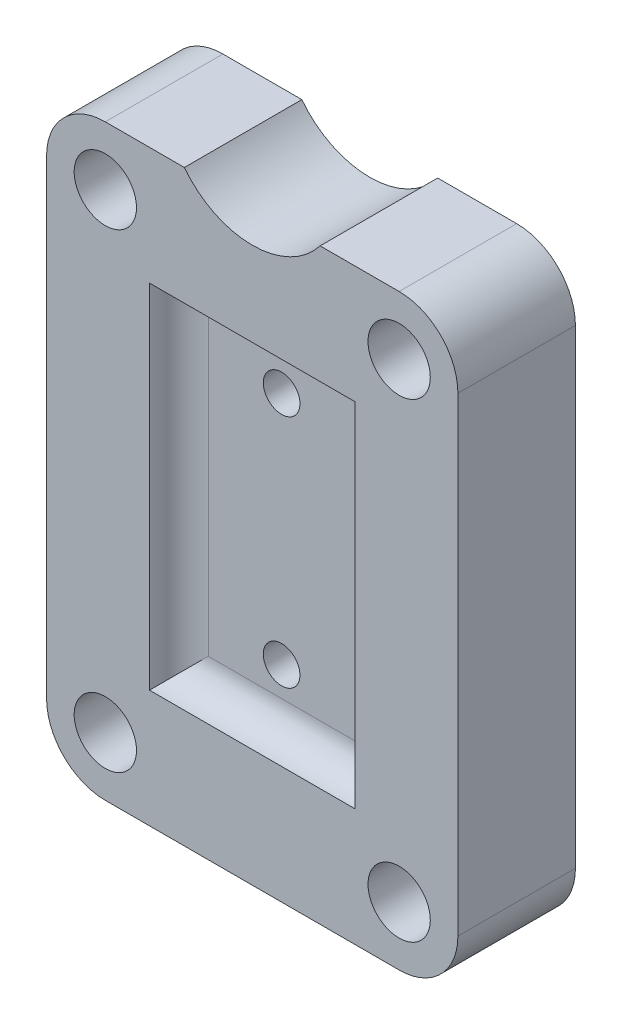
ISO-10303-21;
HEADER;
FILE_DESCRIPTION(('STEP AP214'),'2;1');
FILE_NAME('part.step','',(''),(''),'','','');
FILE_SCHEMA(('AUTOMOTIVE_DESIGN { 1 0 10303 214 1 1 1 1 }'));
ENDSEC;
DATA;
#1=APPLICATION_CONTEXT('core data for automotive mechanical design processes');
#2=APPLICATION_PROTOCOL_DEFINITION('international standard','automotive_design',2000,#1);
#3=PRODUCT_CONTEXT('',#1,'mechanical');
#4=PRODUCT('Part','Part','',(#3));
#5=PRODUCT_RELATED_PRODUCT_CATEGORY('part','',(#4));
#6=PRODUCT_DEFINITION_FORMATION('','',#4);
#7=PRODUCT_DEFINITION_CONTEXT('part definition',#1,'design');
#8=PRODUCT_DEFINITION('design','',#6,#7);
#9=PRODUCT_DEFINITION_SHAPE('','',#8);
#10=(LENGTH_UNIT() NAMED_UNIT(*) SI_UNIT(.MILLI.,.METRE.));
#11=(NAMED_UNIT(*) PLANE_ANGLE_UNIT() SI_UNIT($,.RADIAN.));
#12=(NAMED_UNIT(*) SI_UNIT($,.STERADIAN.) SOLID_ANGLE_UNIT());
#13=UNCERTAINTY_MEASURE_WITH_UNIT(LENGTH_MEASURE(1.E-05),#10,'distance_accuracy_value','');
#14=(GEOMETRIC_REPRESENTATION_CONTEXT(3) GLOBAL_UNCERTAINTY_ASSIGNED_CONTEXT((#13)) GLOBAL_UNIT_ASSIGNED_CONTEXT((#10,
#11,#12)) REPRESENTATION_CONTEXT('',''));
#15=CARTESIAN_POINT('',(0.,0.,0.));
#16=DIRECTION('',(0.,0.,1.));
#17=DIRECTION('',(1.,0.,0.));
#18=AXIS2_PLACEMENT_3D('',#15,#16,#17);
#19=CARTESIAN_POINT('',(44.46,-0.00999999999999889,0.));
#20=DIRECTION('',(0.,0.,-1.));
#21=DIRECTION('',(-1.,0.,0.));
#22=AXIS2_PLACEMENT_3D('',#19,#20,#21);
#23=PLANE('',#22);
#24=CARTESIAN_POINT('',(38.1,6.35,0.));
#25=DIRECTION('',(0.,0.,1.));
#26=DIRECTION('',(1.,0.,0.));
#27=AXIS2_PLACEMENT_3D('',#24,#25,#26);
#28=CIRCLE('',#27,3.3655);
#29=CARTESIAN_POINT('',(41.4655,6.35,0.));
#30=VERTEX_POINT('',#29);
#31=EDGE_CURVE('E139',#30,#30,#28,.F.);
#32=ORIENTED_EDGE('',*,*,#31,.F.);
#33=EDGE_LOOP('',(#32));
#34=FACE_BOUND('',#33,.T.);
#35=CARTESIAN_POINT('',(38.1,57.15,0.));
#36=DIRECTION('',(0.,0.,1.));
#37=DIRECTION('',(1.,0.,0.));
#38=AXIS2_PLACEMENT_3D('',#35,#36,#37);
#39=CIRCLE('',#38,3.3655);
#40=CARTESIAN_POINT('',(41.4655,57.15,0.));
#41=VERTEX_POINT('',#40);
#42=EDGE_CURVE('E142',#41,#41,#39,.F.);
#43=ORIENTED_EDGE('',*,*,#42,.F.);
#44=EDGE_LOOP('',(#43));
#45=FACE_BOUND('',#44,.T.);
#46=CARTESIAN_POINT('',(6.34999999999998,57.15,0.));
#47=DIRECTION('',(0.,0.,1.));
#48=DIRECTION('',(1.,0.,0.));
#49=AXIS2_PLACEMENT_3D('',#46,#47,#48);
#50=CIRCLE('',#49,3.3655);
#51=CARTESIAN_POINT('',(9.71549999999998,57.15,0.));
#52=VERTEX_POINT('',#51);
#53=EDGE_CURVE('E221',#52,#52,#50,.F.);
#54=ORIENTED_EDGE('',*,*,#53,.F.);
#55=EDGE_LOOP('',(#54));
#56=FACE_BOUND('',#55,.T.);
#57=CARTESIAN_POINT('',(6.35,6.35,0.));
#58=DIRECTION('',(0.,0.,1.));
#59=DIRECTION('',(1.,0.,0.));
#60=AXIS2_PLACEMENT_3D('',#57,#58,#59);
#61=CIRCLE('',#60,3.3655);
#62=CARTESIAN_POINT('',(9.7155,6.35,0.));
#63=VERTEX_POINT('',#62);
#64=EDGE_CURVE('E218',#63,#63,#61,.F.);
#65=ORIENTED_EDGE('',*,*,#64,.F.);
#66=EDGE_LOOP('',(#65));
#67=FACE_BOUND('',#66,.T.);
#68=CARTESIAN_POINT('',(22.225,44.45,0.));
#69=DIRECTION('',(0.,0.,1.));
#70=DIRECTION('',(1.,0.,0.));
#71=AXIS2_PLACEMENT_3D('',#68,#69,#70);
#72=CIRCLE('',#71,1.9812);
#73=CARTESIAN_POINT('',(24.2062,44.45,0.));
#74=VERTEX_POINT('',#73);
#75=EDGE_CURVE('E215',#74,#74,#72,.F.);
#76=ORIENTED_EDGE('',*,*,#75,.F.);
#77=EDGE_LOOP('',(#76));
#78=FACE_BOUND('',#77,.T.);
#79=CARTESIAN_POINT('',(22.225,19.05,0.));
#80=DIRECTION('',(0.,0.,-1.));
#81=DIRECTION('',(-1.,0.,0.));
#82=AXIS2_PLACEMENT_3D('',#79,#80,#81);
#83=CIRCLE('',#82,1.9812);
#84=CARTESIAN_POINT('',(20.2438,19.05,0.));
#85=VERTEX_POINT('',#84);
#86=EDGE_CURVE('E212',#85,#85,#83,.T.);
#87=ORIENTED_EDGE('',*,*,#86,.F.);
#88=EDGE_LOOP('',(#87));
#89=FACE_BOUND('',#88,.T.);
#90=CARTESIAN_POINT('',(6.34999999999998,57.15,0.));
#91=DIRECTION('',(0.,0.,-1.));
#92=DIRECTION('',(-1.,0.,0.));
#93=AXIS2_PLACEMENT_3D('',#90,#91,#92);
#94=CIRCLE('',#93,6.35);
#95=CARTESIAN_POINT('',(6.34999999999998,63.5,0.));
#96=VERTEX_POINT('',#95);
#97=CARTESIAN_POINT('',(0.,57.15,0.));
#98=VERTEX_POINT('',#97);
#99=EDGE_CURVE('E230',#96,#98,#94,.F.);
#100=ORIENTED_EDGE('',*,*,#99,.F.);
#101=DIRECTION('',(-1.,0.,0.));
#102=VECTOR('',#101,1.);
#103=CARTESIAN_POINT('',(10.6184298872411,63.5,0.));
#104=LINE('',#103,#102);
#105=CARTESIAN_POINT('',(14.8868597744822,63.5,0.));
#106=VERTEX_POINT('',#105);
#107=EDGE_CURVE('E123',#106,#96,#104,.T.);
#108=ORIENTED_EDGE('',*,*,#107,.F.);
#109=CARTESIAN_POINT('',(22.225,69.1701520438038,0.));
#110=DIRECTION('',(0.,0.,1.));
#111=DIRECTION('',(1.,0.,0.));
#112=AXIS2_PLACEMENT_3D('',#109,#110,#111);
#113=CIRCLE('',#112,9.27356059823923);
#114=CARTESIAN_POINT('',(29.5631402255178,63.5,0.));
#115=VERTEX_POINT('',#114);
#116=EDGE_CURVE('E21',#115,#106,#113,.F.);
#117=ORIENTED_EDGE('',*,*,#116,.F.);
#118=DIRECTION('',(-1.,0.,0.));
#119=VECTOR('',#118,1.);
#120=CARTESIAN_POINT('',(33.8315701127589,63.5,0.));
#121=LINE('',#120,#119);
#122=CARTESIAN_POINT('',(38.1,63.5,0.));
#123=VERTEX_POINT('',#122);
#124=EDGE_CURVE('E121',#123,#115,#121,.T.);
#125=ORIENTED_EDGE('',*,*,#124,.F.);
#126=CARTESIAN_POINT('',(38.1,57.15,0.));
#127=DIRECTION('',(0.,0.,-1.));
#128=DIRECTION('',(-1.,0.,0.));
#129=AXIS2_PLACEMENT_3D('',#126,#127,#128);
#130=CIRCLE('',#129,6.35);
#131=CARTESIAN_POINT('',(44.45,57.15,0.));
#132=VERTEX_POINT('',#131);
#133=EDGE_CURVE('E136',#132,#123,#130,.F.);
#134=ORIENTED_EDGE('',*,*,#133,.F.);
#135=DIRECTION('',(0.,1.,0.));
#136=VECTOR('',#135,1.);
#137=CARTESIAN_POINT('',(44.45,31.75,0.));
#138=LINE('',#137,#136);
#139=CARTESIAN_POINT('',(44.45,6.35,0.));
#140=VERTEX_POINT('',#139);
#141=EDGE_CURVE('E148',#140,#132,#138,.T.);
#142=ORIENTED_EDGE('',*,*,#141,.F.);
#143=CARTESIAN_POINT('',(38.1,6.34999999999999,0.));
#144=DIRECTION('',(0.,0.,-1.));
#145=DIRECTION('',(-1.,0.,0.));
#146=AXIS2_PLACEMENT_3D('',#143,#144,#145);
#147=CIRCLE('',#146,6.35);
#148=CARTESIAN_POINT('',(38.1,0.,0.));
#149=VERTEX_POINT('',#148);
#150=EDGE_CURVE('E227',#149,#140,#147,.F.);
#151=ORIENTED_EDGE('',*,*,#150,.F.);
#152=DIRECTION('',(1.,0.,0.));
#153=VECTOR('',#152,1.);
#154=CARTESIAN_POINT('',(22.225,0.,0.));
#155=LINE('',#154,#153);
#156=CARTESIAN_POINT('',(6.35,0.,0.));
#157=VERTEX_POINT('',#156);
#158=EDGE_CURVE('E152',#157,#149,#155,.T.);
#159=ORIENTED_EDGE('',*,*,#158,.F.);
#160=CARTESIAN_POINT('',(6.35,6.35,0.));
#161=DIRECTION('',(0.,0.,-1.));
#162=DIRECTION('',(-1.,0.,0.));
#163=AXIS2_PLACEMENT_3D('',#160,#161,#162);
#164=CIRCLE('',#163,6.35);
#165=CARTESIAN_POINT('',(0.,6.35,0.));
#166=VERTEX_POINT('',#165);
#167=EDGE_CURVE('E229',#166,#157,#164,.F.);
#168=ORIENTED_EDGE('',*,*,#167,.F.);
#169=DIRECTION('',(0.,-1.,0.));
#170=VECTOR('',#169,1.);
#171=CARTESIAN_POINT('',(0.,31.75,0.));
#172=LINE('',#171,#170);
#173=EDGE_CURVE('E156',#98,#166,#172,.T.);
#174=ORIENTED_EDGE('',*,*,#173,.F.);
#175=EDGE_LOOP('',(#100,#108,#117,#125,#134,#142,#151,#159,#168,#174));
#176=FACE_BOUND('',#175,.T.);
#177=ADVANCED_FACE('F17',(#34,#45,#56,#67,#78,#89,#176),#23,.T.);
#178=CARTESIAN_POINT('',(22.225,69.1701520438038,0.));
#179=DIRECTION('',(0.,0.,1.));
#180=DIRECTION('',(1.,0.,0.));
#181=AXIS2_PLACEMENT_3D('',#178,#179,#180);
#182=CYLINDRICAL_SURFACE('',#181,9.27356059823923);
#183=DIRECTION('',(0.,0.,-1.));
#184=VECTOR('',#183,1.);
#185=CARTESIAN_POINT('',(14.8868597744822,63.5,6.35));
#186=LINE('',#185,#184);
#187=CARTESIAN_POINT('',(14.8868597744822,63.5,12.7));
#188=VERTEX_POINT('',#187);
#189=EDGE_CURVE('E126',#188,#106,#186,.T.);
#190=ORIENTED_EDGE('',*,*,#189,.F.);
#191=CARTESIAN_POINT('',(22.225,69.1701520438038,12.7));
#192=DIRECTION('',(0.,0.,1.));
#193=DIRECTION('',(1.,0.,0.));
#194=AXIS2_PLACEMENT_3D('',#191,#192,#193);
#195=CIRCLE('',#194,9.27356059823923);
#196=CARTESIAN_POINT('',(29.5631402255177,63.5,12.7));
#197=VERTEX_POINT('',#196);
#198=EDGE_CURVE('E131',#197,#188,#195,.F.);
#199=ORIENTED_EDGE('',*,*,#198,.F.);
#200=DIRECTION('',(0.,0.,1.));
#201=VECTOR('',#200,1.);
#202=CARTESIAN_POINT('',(29.5631402255177,63.5,6.35));
#203=LINE('',#202,#201);
#204=EDGE_CURVE('E128',#115,#197,#203,.T.);
#205=ORIENTED_EDGE('',*,*,#204,.F.);
#206=ORIENTED_EDGE('',*,*,#116,.T.);
#207=EDGE_LOOP('',(#190,#199,#205,#206));
#208=FACE_BOUND('',#207,.T.);
#209=ADVANCED_FACE('F129',(#208),#182,.F.);
#210=CARTESIAN_POINT('',(6.33999999999999,63.5,-0.01));
#211=DIRECTION('',(0.,1.,0.));
#212=DIRECTION('',(0.,0.,1.));
#213=AXIS2_PLACEMENT_3D('',#210,#211,#212);
#214=PLANE('',#213);
#215=DIRECTION('',(0.,0.,-1.));
#216=VECTOR('',#215,1.);
#217=CARTESIAN_POINT('',(6.34999999999998,63.5,6.35));
#218=LINE('',#217,#216);
#219=CARTESIAN_POINT('',(6.34999999999998,63.5,12.7));
#220=VERTEX_POINT('',#219);
#221=EDGE_CURVE('E160',#220,#96,#218,.T.);
#222=ORIENTED_EDGE('',*,*,#221,.F.);
#223=DIRECTION('',(-1.,0.,0.));
#224=VECTOR('',#223,1.);
#225=CARTESIAN_POINT('',(22.225,63.5,12.7));
#226=LINE('',#225,#224);
#227=EDGE_CURVE('E210',#188,#220,#226,.T.);
#228=ORIENTED_EDGE('',*,*,#227,.F.);
#229=ORIENTED_EDGE('',*,*,#189,.T.);
#230=ORIENTED_EDGE('',*,*,#107,.T.);
#231=EDGE_LOOP('',(#222,#228,#229,#230));
#232=FACE_BOUND('',#231,.T.);
#233=ADVANCED_FACE('F320',(#232),#214,.T.);
#234=CARTESIAN_POINT('',(6.34999999999998,57.15,12.7));
#235=DIRECTION('',(0.,0.,-1.));
#236=DIRECTION('',(-1.,0.,0.));
#237=AXIS2_PLACEMENT_3D('',#234,#235,#236);
#238=CYLINDRICAL_SURFACE('',#237,6.35);
#239=ORIENTED_EDGE('',*,*,#99,.T.);
#240=DIRECTION('',(0.,0.,-1.));
#241=VECTOR('',#240,1.);
#242=CARTESIAN_POINT('',(0.,57.15,6.35));
#243=LINE('',#242,#241);
#244=CARTESIAN_POINT('',(0.,57.15,12.7));
#245=VERTEX_POINT('',#244);
#246=EDGE_CURVE('E159',#245,#98,#243,.T.);
#247=ORIENTED_EDGE('',*,*,#246,.F.);
#248=CARTESIAN_POINT('',(6.34999999999998,57.15,12.7));
#249=DIRECTION('',(0.,0.,-1.));
#250=DIRECTION('',(-1.,0.,0.));
#251=AXIS2_PLACEMENT_3D('',#248,#249,#250);
#252=CIRCLE('',#251,6.35);
#253=EDGE_CURVE('E207',#220,#245,#252,.F.);
#254=ORIENTED_EDGE('',*,*,#253,.F.);
#255=ORIENTED_EDGE('',*,*,#221,.T.);
#256=EDGE_LOOP('',(#239,#247,#254,#255));
#257=FACE_BOUND('',#256,.T.);
#258=ADVANCED_FACE('F317',(#257),#238,.T.);
#259=CARTESIAN_POINT('',(0.,6.33999999999999,-0.01));
#260=DIRECTION('',(-1.,0.,0.));
#261=DIRECTION('',(0.,0.,1.));
#262=AXIS2_PLACEMENT_3D('',#259,#260,#261);
#263=PLANE('',#262);
#264=DIRECTION('',(0.,0.,-1.));
#265=VECTOR('',#264,1.);
#266=CARTESIAN_POINT('',(0.,6.35,6.35));
#267=LINE('',#266,#265);
#268=CARTESIAN_POINT('',(0.,6.35,12.7));
#269=VERTEX_POINT('',#268);
#270=EDGE_CURVE('E158',#269,#166,#267,.T.);
#271=ORIENTED_EDGE('',*,*,#270,.F.);
#272=DIRECTION('',(0.,-1.,0.));
#273=VECTOR('',#272,1.);
#274=CARTESIAN_POINT('',(0.,31.75,12.7));
#275=LINE('',#274,#273);
#276=EDGE_CURVE('E206',#245,#269,#275,.T.);
#277=ORIENTED_EDGE('',*,*,#276,.F.);
#278=ORIENTED_EDGE('',*,*,#246,.T.);
#279=ORIENTED_EDGE('',*,*,#173,.T.);
#280=EDGE_LOOP('',(#271,#277,#278,#279));
#281=FACE_BOUND('',#280,.T.);
#282=ADVANCED_FACE('F316',(#281),#263,.T.);
#283=CARTESIAN_POINT('',(6.35,6.35,12.7));
#284=DIRECTION('',(0.,0.,-1.));
#285=DIRECTION('',(-1.,0.,0.));
#286=AXIS2_PLACEMENT_3D('',#283,#284,#285);
#287=CYLINDRICAL_SURFACE('',#286,6.35);
#288=ORIENTED_EDGE('',*,*,#167,.T.);
#289=DIRECTION('',(0.,0.,-1.));
#290=VECTOR('',#289,1.);
#291=CARTESIAN_POINT('',(6.35,0.,6.35));
#292=LINE('',#291,#290);
#293=CARTESIAN_POINT('',(6.35,0.,12.7));
#294=VERTEX_POINT('',#293);
#295=EDGE_CURVE('E155',#294,#157,#292,.T.);
#296=ORIENTED_EDGE('',*,*,#295,.F.);
#297=CARTESIAN_POINT('',(6.35,6.35,12.7));
#298=DIRECTION('',(0.,0.,-1.));
#299=DIRECTION('',(-1.,0.,0.));
#300=AXIS2_PLACEMENT_3D('',#297,#298,#299);
#301=CIRCLE('',#300,6.35);
#302=EDGE_CURVE('E203',#269,#294,#301,.F.);
#303=ORIENTED_EDGE('',*,*,#302,.F.);
#304=ORIENTED_EDGE('',*,*,#270,.T.);
#305=EDGE_LOOP('',(#288,#296,#303,#304));
#306=FACE_BOUND('',#305,.T.);
#307=ADVANCED_FACE('F313',(#306),#287,.T.);
#308=CARTESIAN_POINT('',(6.33999999999999,0.,12.71));
#309=DIRECTION('',(0.,-1.,0.));
#310=DIRECTION('',(0.,0.,-1.));
#311=AXIS2_PLACEMENT_3D('',#308,#309,#310);
#312=PLANE('',#311);
#313=ORIENTED_EDGE('',*,*,#295,.T.);
#314=ORIENTED_EDGE('',*,*,#158,.T.);
#315=DIRECTION('',(0.,0.,-1.));
#316=VECTOR('',#315,1.);
#317=CARTESIAN_POINT('',(38.1,0.,6.35));
#318=LINE('',#317,#316);
#319=CARTESIAN_POINT('',(38.1,0.,12.7));
#320=VERTEX_POINT('',#319);
#321=EDGE_CURVE('E154',#320,#149,#318,.T.);
#322=ORIENTED_EDGE('',*,*,#321,.F.);
#323=DIRECTION('',(1.,0.,0.));
#324=VECTOR('',#323,1.);
#325=CARTESIAN_POINT('',(22.225,0.,12.7));
#326=LINE('',#325,#324);
#327=EDGE_CURVE('E202',#294,#320,#326,.T.);
#328=ORIENTED_EDGE('',*,*,#327,.F.);
#329=EDGE_LOOP('',(#313,#314,#322,#328));
#330=FACE_BOUND('',#329,.T.);
#331=ADVANCED_FACE('F309',(#330),#312,.T.);
#332=CARTESIAN_POINT('',(38.1,6.34999999999999,12.7));
#333=DIRECTION('',(0.,0.,-1.));
#334=DIRECTION('',(-1.,0.,0.));
#335=AXIS2_PLACEMENT_3D('',#332,#333,#334);
#336=CYLINDRICAL_SURFACE('',#335,6.35);
#337=ORIENTED_EDGE('',*,*,#150,.T.);
#338=DIRECTION('',(0.,0.,-1.));
#339=VECTOR('',#338,1.);
#340=CARTESIAN_POINT('',(44.45,6.35,6.35));
#341=LINE('',#340,#339);
#342=CARTESIAN_POINT('',(44.45,6.35,12.7));
#343=VERTEX_POINT('',#342);
#344=EDGE_CURVE('E151',#343,#140,#341,.T.);
#345=ORIENTED_EDGE('',*,*,#344,.F.);
#346=CARTESIAN_POINT('',(38.1,6.34999999999999,12.7));
#347=DIRECTION('',(0.,0.,-1.));
#348=DIRECTION('',(-1.,0.,0.));
#349=AXIS2_PLACEMENT_3D('',#346,#347,#348);
#350=CIRCLE('',#349,6.35);
#351=EDGE_CURVE('E199',#320,#343,#350,.F.);
#352=ORIENTED_EDGE('',*,*,#351,.F.);
#353=ORIENTED_EDGE('',*,*,#321,.T.);
#354=EDGE_LOOP('',(#337,#345,#352,#353));
#355=FACE_BOUND('',#354,.T.);
#356=ADVANCED_FACE('F306',(#355),#336,.T.);
#357=CARTESIAN_POINT('',(44.45,6.33999999999999,12.71));
#358=DIRECTION('',(1.,0.,0.));
#359=DIRECTION('',(0.,0.,-1.));
#360=AXIS2_PLACEMENT_3D('',#357,#358,#359);
#361=PLANE('',#360);
#362=DIRECTION('',(0.,0.,-1.));
#363=VECTOR('',#362,1.);
#364=CARTESIAN_POINT('',(44.45,57.15,6.35));
#365=LINE('',#364,#363);
#366=CARTESIAN_POINT('',(44.45,57.15,12.7));
#367=VERTEX_POINT('',#366);
#368=EDGE_CURVE('E150',#367,#132,#365,.T.);
#369=ORIENTED_EDGE('',*,*,#368,.F.);
#370=DIRECTION('',(0.,1.,0.));
#371=VECTOR('',#370,1.);
#372=CARTESIAN_POINT('',(44.45,31.75,12.7));
#373=LINE('',#372,#371);
#374=EDGE_CURVE('E198',#343,#367,#373,.T.);
#375=ORIENTED_EDGE('',*,*,#374,.F.);
#376=ORIENTED_EDGE('',*,*,#344,.T.);
#377=ORIENTED_EDGE('',*,*,#141,.T.);
#378=EDGE_LOOP('',(#369,#375,#376,#377));
#379=FACE_BOUND('',#378,.T.);
#380=ADVANCED_FACE('F303',(#379),#361,.T.);
#381=CARTESIAN_POINT('',(38.1,57.15,12.7));
#382=DIRECTION('',(0.,0.,-1.));
#383=DIRECTION('',(-1.,0.,0.));
#384=AXIS2_PLACEMENT_3D('',#381,#382,#383);
#385=CYLINDRICAL_SURFACE('',#384,6.35);
#386=ORIENTED_EDGE('',*,*,#133,.T.);
#387=DIRECTION('',(0.,0.,-1.));
#388=VECTOR('',#387,1.);
#389=CARTESIAN_POINT('',(38.1,63.5,6.35));
#390=LINE('',#389,#388);
#391=CARTESIAN_POINT('',(38.1,63.5,12.7));
#392=VERTEX_POINT('',#391);
#393=EDGE_CURVE('E135',#392,#123,#390,.T.);
#394=ORIENTED_EDGE('',*,*,#393,.F.);
#395=CARTESIAN_POINT('',(38.1,57.15,12.7));
#396=DIRECTION('',(0.,0.,-1.));
#397=DIRECTION('',(-1.,0.,0.));
#398=AXIS2_PLACEMENT_3D('',#395,#396,#397);
#399=CIRCLE('',#398,6.35);
#400=EDGE_CURVE('E195',#367,#392,#399,.F.);
#401=ORIENTED_EDGE('',*,*,#400,.F.);
#402=ORIENTED_EDGE('',*,*,#368,.T.);
#403=EDGE_LOOP('',(#386,#394,#401,#402));
#404=FACE_BOUND('',#403,.T.);
#405=ADVANCED_FACE('F298',(#404),#385,.T.);
#406=CARTESIAN_POINT('',(29.5531402255178,63.5,-0.01));
#407=DIRECTION('',(0.,1.,0.));
#408=DIRECTION('',(0.,0.,1.));
#409=AXIS2_PLACEMENT_3D('',#406,#407,#408);
#410=PLANE('',#409);
#411=ORIENTED_EDGE('',*,*,#393,.T.);
#412=ORIENTED_EDGE('',*,*,#124,.T.);
#413=ORIENTED_EDGE('',*,*,#204,.T.);
#414=DIRECTION('',(-1.,0.,0.));
#415=VECTOR('',#414,1.);
#416=CARTESIAN_POINT('',(22.225,63.5,12.7));
#417=LINE('',#416,#415);
#418=EDGE_CURVE('E194',#392,#197,#417,.T.);
#419=ORIENTED_EDGE('',*,*,#418,.F.);
#420=EDGE_LOOP('',(#411,#412,#413,#419));
#421=FACE_BOUND('',#420,.T.);
#422=ADVANCED_FACE('F138',(#421),#410,.T.);
#423=CARTESIAN_POINT('',(38.1,6.35,0.));
#424=DIRECTION('',(0.,0.,1.));
#425=DIRECTION('',(1.,0.,0.));
#426=AXIS2_PLACEMENT_3D('',#423,#424,#425);
#427=CYLINDRICAL_SURFACE('',#426,3.3655);
#428=ORIENTED_EDGE('',*,*,#31,.T.);
#429=EDGE_LOOP('',(#428));
#430=FACE_BOUND('',#429,.T.);
#431=CARTESIAN_POINT('',(38.1,6.35,12.7));
#432=DIRECTION('',(0.,0.,1.));
#433=DIRECTION('',(1.,0.,0.));
#434=AXIS2_PLACEMENT_3D('',#431,#432,#433);
#435=CIRCLE('',#434,3.3655);
#436=CARTESIAN_POINT('',(41.4655,6.35,12.7));
#437=VERTEX_POINT('',#436);
#438=EDGE_CURVE('E191',#437,#437,#435,.F.);
#439=ORIENTED_EDGE('',*,*,#438,.F.);
#440=EDGE_LOOP('',(#439));
#441=FACE_BOUND('',#440,.T.);
#442=ADVANCED_FACE('F363',(#430,#441),#427,.F.);
#443=CARTESIAN_POINT('',(38.1,57.15,0.));
#444=DIRECTION('',(0.,0.,1.));
#445=DIRECTION('',(1.,0.,0.));
#446=AXIS2_PLACEMENT_3D('',#443,#444,#445);
#447=CYLINDRICAL_SURFACE('',#446,3.3655);
#448=ORIENTED_EDGE('',*,*,#42,.T.);
#449=EDGE_LOOP('',(#448));
#450=FACE_BOUND('',#449,.T.);
#451=CARTESIAN_POINT('',(38.1,57.15,12.7));
#452=DIRECTION('',(0.,0.,1.));
#453=DIRECTION('',(1.,0.,0.));
#454=AXIS2_PLACEMENT_3D('',#451,#452,#453);
#455=CIRCLE('',#454,3.3655);
#456=CARTESIAN_POINT('',(41.4655,57.15,12.7));
#457=VERTEX_POINT('',#456);
#458=EDGE_CURVE('E188',#457,#457,#455,.F.);
#459=ORIENTED_EDGE('',*,*,#458,.F.);
#460=EDGE_LOOP('',(#459));
#461=FACE_BOUND('',#460,.T.);
#462=ADVANCED_FACE('F359',(#450,#461),#447,.F.);
#463=CARTESIAN_POINT('',(6.34999999999998,57.15,0.));
#464=DIRECTION('',(0.,0.,1.));
#465=DIRECTION('',(1.,0.,0.));
#466=AXIS2_PLACEMENT_3D('',#463,#464,#465);
#467=CYLINDRICAL_SURFACE('',#466,3.3655);
#468=ORIENTED_EDGE('',*,*,#53,.T.);
#469=EDGE_LOOP('',(#468));
#470=FACE_BOUND('',#469,.T.);
#471=CARTESIAN_POINT('',(6.34999999999998,57.15,12.7));
#472=DIRECTION('',(0.,0.,1.));
#473=DIRECTION('',(1.,0.,0.));
#474=AXIS2_PLACEMENT_3D('',#471,#472,#473);
#475=CIRCLE('',#474,3.3655);
#476=CARTESIAN_POINT('',(9.71549999999998,57.15,12.7));
#477=VERTEX_POINT('',#476);
#478=EDGE_CURVE('E185',#477,#477,#475,.F.);
#479=ORIENTED_EDGE('',*,*,#478,.F.);
#480=EDGE_LOOP('',(#479));
#481=FACE_BOUND('',#480,.T.);
#482=ADVANCED_FACE('F355',(#470,#481),#467,.F.);
#483=CARTESIAN_POINT('',(6.35,6.35,0.));
#484=DIRECTION('',(0.,0.,1.));
#485=DIRECTION('',(1.,0.,0.));
#486=AXIS2_PLACEMENT_3D('',#483,#484,#485);
#487=CYLINDRICAL_SURFACE('',#486,3.3655);
#488=ORIENTED_EDGE('',*,*,#64,.T.);
#489=EDGE_LOOP('',(#488));
#490=FACE_BOUND('',#489,.T.);
#491=CARTESIAN_POINT('',(6.35,6.35,12.7));
#492=DIRECTION('',(0.,0.,1.));
#493=DIRECTION('',(1.,0.,0.));
#494=AXIS2_PLACEMENT_3D('',#491,#492,#493);
#495=CIRCLE('',#494,3.3655);
#496=CARTESIAN_POINT('',(9.7155,6.35,12.7));
#497=VERTEX_POINT('',#496);
#498=EDGE_CURVE('E181',#497,#497,#495,.F.);
#499=ORIENTED_EDGE('',*,*,#498,.F.);
#500=EDGE_LOOP('',(#499));
#501=FACE_BOUND('',#500,.T.);
#502=ADVANCED_FACE('F351',(#490,#501),#487,.F.);
#503=CARTESIAN_POINT('',(22.225,44.45,0.));
#504=DIRECTION('',(0.,0.,1.));
#505=DIRECTION('',(1.,0.,0.));
#506=AXIS2_PLACEMENT_3D('',#503,#504,#505);
#507=CYLINDRICAL_SURFACE('',#506,1.9812);
#508=ORIENTED_EDGE('',*,*,#75,.T.);
#509=EDGE_LOOP('',(#508));
#510=FACE_BOUND('',#509,.T.);
#511=CARTESIAN_POINT('',(22.225,44.45,9.525));
#512=DIRECTION('',(0.,0.,1.));
#513=DIRECTION('',(1.,0.,0.));
#514=AXIS2_PLACEMENT_3D('',#511,#512,#513);
#515=CIRCLE('',#514,1.9812);
#516=CARTESIAN_POINT('',(24.2062,44.45,9.525));
#517=VERTEX_POINT('',#516);
#518=EDGE_CURVE('E173',#517,#517,#515,.F.);
#519=ORIENTED_EDGE('',*,*,#518,.F.);
#520=EDGE_LOOP('',(#519));
#521=FACE_BOUND('',#520,.T.);
#522=ADVANCED_FACE('F347',(#510,#521),#507,.F.);
#523=CARTESIAN_POINT('',(22.225,19.05,9.525));
#524=DIRECTION('',(0.,0.,-1.));
#525=DIRECTION('',(-1.,0.,0.));
#526=AXIS2_PLACEMENT_3D('',#523,#524,#525);
#527=CYLINDRICAL_SURFACE('',#526,1.9812);
#528=ORIENTED_EDGE('',*,*,#86,.T.);
#529=EDGE_LOOP('',(#528));
#530=FACE_BOUND('',#529,.T.);
#531=CARTESIAN_POINT('',(22.225,19.05,9.525));
#532=DIRECTION('',(0.,0.,-1.));
#533=DIRECTION('',(-1.,0.,0.));
#534=AXIS2_PLACEMENT_3D('',#531,#532,#533);
#535=CIRCLE('',#534,1.9812);
#536=CARTESIAN_POINT('',(20.2438,19.05,9.525));
#537=VERTEX_POINT('',#536);
#538=EDGE_CURVE('E169',#537,#537,#535,.T.);
#539=ORIENTED_EDGE('',*,*,#538,.F.);
#540=EDGE_LOOP('',(#539));
#541=FACE_BOUND('',#540,.T.);
#542=ADVANCED_FACE('F344',(#530,#541),#527,.F.);
#543=CARTESIAN_POINT('',(14.3002,50.8,12.7));
#544=DIRECTION('',(0.,-1.,0.));
#545=DIRECTION('',(0.,0.,-1.));
#546=AXIS2_PLACEMENT_3D('',#543,#544,#545);
#547=CYLINDRICAL_SURFACE('',#546,3.17500000000001);
#548=DIRECTION('',(0.,-1.,0.));
#549=VECTOR('',#548,1.);
#550=CARTESIAN_POINT('',(14.3002,31.75,9.525));
#551=LINE('',#550,#549);
#552=CARTESIAN_POINT('',(14.3002,47.625,9.525));
#553=VERTEX_POINT('',#552);
#554=CARTESIAN_POINT('',(14.3002,15.875,9.525));
#555=VERTEX_POINT('',#554);
#556=EDGE_CURVE('E176',#553,#555,#551,.T.);
#557=ORIENTED_EDGE('',*,*,#556,.F.);
#558=CARTESIAN_POINT('',(14.3002,47.625,12.7));
#559=DIRECTION('',(-0.707106781186547,-0.707106781186547,0.));
#560=DIRECTION('',(0.707106781186547,-0.707106781186547,0.));
#561=AXIS2_PLACEMENT_3D('',#558,#559,#560);
#562=ELLIPSE('',#561,4.49012806053458,3.17500000000001);
#563=CARTESIAN_POINT('',(11.1252,50.8,12.7));
#564=VERTEX_POINT('',#563);
#565=EDGE_CURVE('E177',#564,#553,#562,.T.);
#566=ORIENTED_EDGE('',*,*,#565,.F.);
#567=DIRECTION('',(0.,1.,0.));
#568=VECTOR('',#567,1.);
#569=CARTESIAN_POINT('',(11.1252,31.75,12.7));
#570=LINE('',#569,#568);
#571=CARTESIAN_POINT('',(11.1252,12.7,12.7));
#572=VERTEX_POINT('',#571);
#573=EDGE_CURVE('E184',#572,#564,#570,.T.);
#574=ORIENTED_EDGE('',*,*,#573,.F.);
#575=CARTESIAN_POINT('',(14.3002,15.875,12.7));
#576=DIRECTION('',(0.707106781186547,-0.707106781186547,0.));
#577=DIRECTION('',(0.707106781186547,0.707106781186547,0.));
#578=AXIS2_PLACEMENT_3D('',#575,#576,#577);
#579=ELLIPSE('',#578,4.49012806053459,3.17500000000001);
#580=EDGE_CURVE('E166',#555,#572,#579,.F.);
#581=ORIENTED_EDGE('',*,*,#580,.F.);
#582=EDGE_LOOP('',(#557,#566,#574,#581));
#583=FACE_BOUND('',#582,.T.);
#584=ADVANCED_FACE('F278',(#583),#547,.F.);
#585=CARTESIAN_POINT('',(-0.0100000000000167,-0.00999999999999889,12.7));
#586=DIRECTION('',(0.,0.,1.));
#587=DIRECTION('',(1.,0.,0.));
#588=AXIS2_PLACEMENT_3D('',#585,#586,#587);
#589=PLANE('',#588);
#590=DIRECTION('',(0.,1.,0.));
#591=VECTOR('',#590,1.);
#592=CARTESIAN_POINT('',(33.3502,31.75,12.7));
#593=LINE('',#592,#591);
#594=CARTESIAN_POINT('',(33.3502,12.7,12.7));
#595=VERTEX_POINT('',#594);
#596=CARTESIAN_POINT('',(33.3502,50.8,12.7));
#597=VERTEX_POINT('',#596);
#598=EDGE_CURVE('E165',#595,#597,#593,.T.);
#599=ORIENTED_EDGE('',*,*,#598,.F.);
#600=DIRECTION('',(1.,0.,0.));
#601=VECTOR('',#600,1.);
#602=CARTESIAN_POINT('',(22.2377,12.7,12.7));
#603=LINE('',#602,#601);
#604=EDGE_CURVE('E172',#572,#595,#603,.T.);
#605=ORIENTED_EDGE('',*,*,#604,.F.);
#606=ORIENTED_EDGE('',*,*,#573,.T.);
#607=DIRECTION('',(-1.,0.,0.));
#608=VECTOR('',#607,1.);
#609=CARTESIAN_POINT('',(22.2377,50.8,12.7));
#610=LINE('',#609,#608);
#611=EDGE_CURVE('E180',#597,#564,#610,.T.);
#612=ORIENTED_EDGE('',*,*,#611,.F.);
#613=EDGE_LOOP('',(#599,#605,#606,#612));
#614=FACE_BOUND('',#613,.T.);
#615=ORIENTED_EDGE('',*,*,#498,.T.);
#616=EDGE_LOOP('',(#615));
#617=FACE_BOUND('',#616,.T.);
#618=ORIENTED_EDGE('',*,*,#478,.T.);
#619=EDGE_LOOP('',(#618));
#620=FACE_BOUND('',#619,.T.);
#621=ORIENTED_EDGE('',*,*,#458,.T.);
#622=EDGE_LOOP('',(#621));
#623=FACE_BOUND('',#622,.T.);
#624=ORIENTED_EDGE('',*,*,#438,.T.);
#625=EDGE_LOOP('',(#624));
#626=FACE_BOUND('',#625,.T.);
#627=ORIENTED_EDGE('',*,*,#400,.T.);
#628=ORIENTED_EDGE('',*,*,#418,.T.);
#629=ORIENTED_EDGE('',*,*,#198,.T.);
#630=ORIENTED_EDGE('',*,*,#227,.T.);
#631=ORIENTED_EDGE('',*,*,#253,.T.);
#632=ORIENTED_EDGE('',*,*,#276,.T.);
#633=ORIENTED_EDGE('',*,*,#302,.T.);
#634=ORIENTED_EDGE('',*,*,#327,.T.);
#635=ORIENTED_EDGE('',*,*,#351,.T.);
#636=ORIENTED_EDGE('',*,*,#374,.T.);
#637=EDGE_LOOP('',(#627,#628,#629,#630,#631,#632,#633,#634,#635,#636));
#638=FACE_BOUND('',#637,.T.);
#639=ADVANCED_FACE('F283',(#614,#617,#620,#623,#626,#638),#589,.T.);
#640=CARTESIAN_POINT('',(33.3502,47.625,12.7));
#641=DIRECTION('',(-1.,0.,0.));
#642=DIRECTION('',(0.,0.,1.));
#643=AXIS2_PLACEMENT_3D('',#640,#641,#642);
#644=CYLINDRICAL_SURFACE('',#643,3.175);
#645=DIRECTION('',(-1.,0.,0.));
#646=VECTOR('',#645,1.);
#647=CARTESIAN_POINT('',(22.2377,47.625,9.525));
#648=LINE('',#647,#646);
#649=CARTESIAN_POINT('',(30.1752,47.625,9.525));
#650=VERTEX_POINT('',#649);
#651=EDGE_CURVE('E179',#650,#553,#648,.T.);
#652=ORIENTED_EDGE('',*,*,#651,.F.);
#653=CARTESIAN_POINT('',(30.1752,47.625,12.7));
#654=DIRECTION('',(-0.707106781186547,0.707106781186547,0.));
#655=DIRECTION('',(-0.707106781186547,-0.707106781186547,0.));
#656=AXIS2_PLACEMENT_3D('',#653,#654,#655);
#657=ELLIPSE('',#656,4.49012806053457,3.175);
#658=EDGE_CURVE('E162',#597,#650,#657,.T.);
#659=ORIENTED_EDGE('',*,*,#658,.F.);
#660=ORIENTED_EDGE('',*,*,#611,.T.);
#661=ORIENTED_EDGE('',*,*,#565,.T.);
#662=EDGE_LOOP('',(#652,#659,#660,#661));
#663=FACE_BOUND('',#662,.T.);
#664=ADVANCED_FACE('F275',(#663),#644,.F.);
#665=CARTESIAN_POINT('',(14.2902,15.865,9.525));
#666=DIRECTION('',(0.,0.,1.));
#667=DIRECTION('',(1.,0.,0.));
#668=AXIS2_PLACEMENT_3D('',#665,#666,#667);
#669=PLANE('',#668);
#670=ORIENTED_EDGE('',*,*,#538,.T.);
#671=EDGE_LOOP('',(#670));
#672=FACE_BOUND('',#671,.T.);
#673=ORIENTED_EDGE('',*,*,#518,.T.);
#674=EDGE_LOOP('',(#673));
#675=FACE_BOUND('',#674,.T.);
#676=ORIENTED_EDGE('',*,*,#556,.T.);
#677=DIRECTION('',(-1.,0.,0.));
#678=VECTOR('',#677,1.);
#679=CARTESIAN_POINT('',(22.2377,15.875,9.525));
#680=LINE('',#679,#678);
#681=CARTESIAN_POINT('',(30.1752,15.875,9.525));
#682=VERTEX_POINT('',#681);
#683=EDGE_CURVE('E36',#682,#555,#680,.T.);
#684=ORIENTED_EDGE('',*,*,#683,.F.);
#685=DIRECTION('',(0.,-1.,0.));
#686=VECTOR('',#685,1.);
#687=CARTESIAN_POINT('',(30.1752,31.75,9.525));
#688=LINE('',#687,#686);
#689=EDGE_CURVE('E27',#650,#682,#688,.T.);
#690=ORIENTED_EDGE('',*,*,#689,.F.);
#691=ORIENTED_EDGE('',*,*,#651,.T.);
#692=EDGE_LOOP('',(#676,#684,#690,#691));
#693=FACE_BOUND('',#692,.T.);
#694=ADVANCED_FACE('F271',(#672,#675,#693),#669,.T.);
#695=CARTESIAN_POINT('',(11.1252,15.875,12.7));
#696=DIRECTION('',(1.,0.,0.));
#697=DIRECTION('',(0.,0.,-1.));
#698=AXIS2_PLACEMENT_3D('',#695,#696,#697);
#699=CYLINDRICAL_SURFACE('',#698,3.175);
#700=ORIENTED_EDGE('',*,*,#683,.T.);
#701=ORIENTED_EDGE('',*,*,#580,.T.);
#702=ORIENTED_EDGE('',*,*,#604,.T.);
#703=CARTESIAN_POINT('',(30.1752,15.875,12.7));
#704=DIRECTION('',(0.707106781186547,0.707106781186547,0.));
#705=DIRECTION('',(0.707106781186547,-0.707106781186547,0.));
#706=AXIS2_PLACEMENT_3D('',#703,#704,#705);
#707=ELLIPSE('',#706,4.49012806053458,3.175);
#708=EDGE_CURVE('E11',#682,#595,#707,.F.);
#709=ORIENTED_EDGE('',*,*,#708,.F.);
#710=EDGE_LOOP('',(#700,#701,#702,#709));
#711=FACE_BOUND('',#710,.T.);
#712=ADVANCED_FACE('F281',(#711),#699,.F.);
#713=CARTESIAN_POINT('',(30.1752,12.7,12.7));
#714=DIRECTION('',(0.,1.,0.));
#715=DIRECTION('',(0.,0.,1.));
#716=AXIS2_PLACEMENT_3D('',#713,#714,#715);
#717=CYLINDRICAL_SURFACE('',#716,3.175);
#718=ORIENTED_EDGE('',*,*,#689,.T.);
#719=ORIENTED_EDGE('',*,*,#708,.T.);
#720=ORIENTED_EDGE('',*,*,#598,.T.);
#721=ORIENTED_EDGE('',*,*,#658,.T.);
#722=EDGE_LOOP('',(#718,#719,#720,#721));
#723=FACE_BOUND('',#722,.T.);
#724=ADVANCED_FACE('F19',(#723),#717,.F.);
#725=CLOSED_SHELL('',(#177,#209,#233,#258,#282,#307,#331,#356,#380,#405,#422,#442,#462,#482,
#502,#522,#542,#584,#639,#664,#694,#712,#724));
#726=MANIFOLD_SOLID_BREP('B1',#725);
#727=ADVANCED_BREP_SHAPE_REPRESENTATION('',(#18,#726),#14);
#728=SHAPE_DEFINITION_REPRESENTATION(#9,#727);
ENDSEC;
END-ISO-10303-21;
